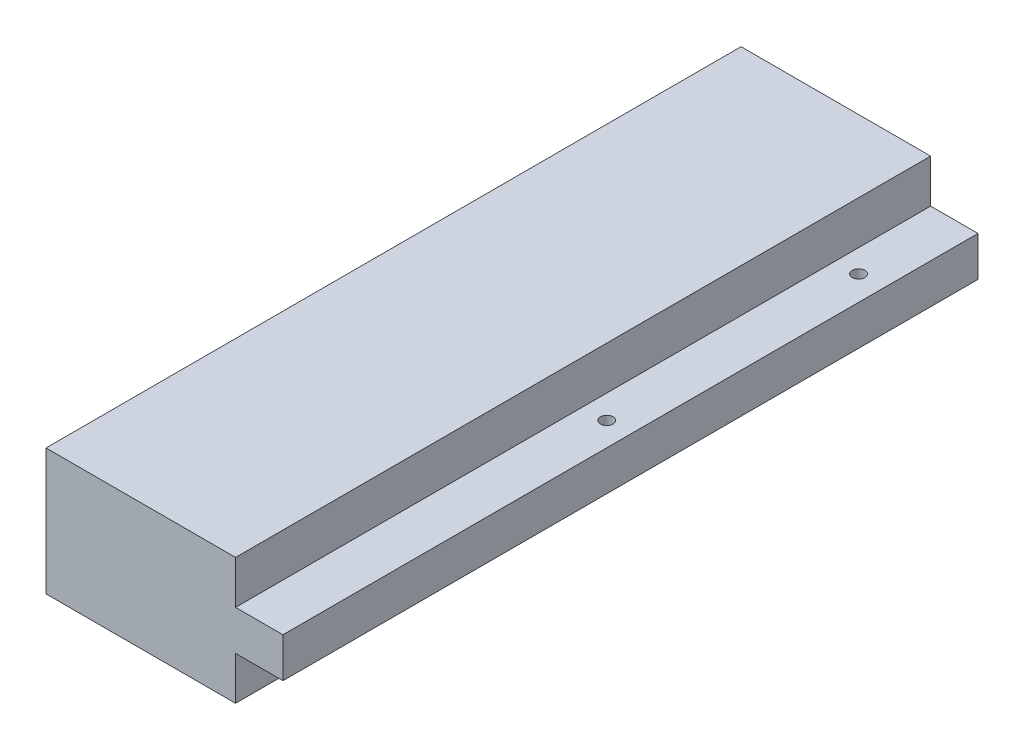
ISO-10303-21;
HEADER;
FILE_DESCRIPTION(('STEP AP214'),'2;1');
FILE_NAME('part.step','',(''),(''),'','','');
FILE_SCHEMA(('AUTOMOTIVE_DESIGN { 1 0 10303 214 1 1 1 1 }'));
ENDSEC;
DATA;
#1=APPLICATION_CONTEXT('core data for automotive mechanical design processes');
#2=APPLICATION_PROTOCOL_DEFINITION('international standard','automotive_design',2000,#1);
#3=PRODUCT_CONTEXT('',#1,'mechanical');
#4=PRODUCT('Part','Part','',(#3));
#5=PRODUCT_RELATED_PRODUCT_CATEGORY('part','',(#4));
#6=PRODUCT_DEFINITION_FORMATION('','',#4);
#7=PRODUCT_DEFINITION_CONTEXT('part definition',#1,'design');
#8=PRODUCT_DEFINITION('design','',#6,#7);
#9=PRODUCT_DEFINITION_SHAPE('','',#8);
#10=(LENGTH_UNIT() NAMED_UNIT(*) SI_UNIT(.MILLI.,.METRE.));
#11=(NAMED_UNIT(*) PLANE_ANGLE_UNIT() SI_UNIT($,.RADIAN.));
#12=(NAMED_UNIT(*) SI_UNIT($,.STERADIAN.) SOLID_ANGLE_UNIT());
#13=UNCERTAINTY_MEASURE_WITH_UNIT(LENGTH_MEASURE(1.E-05),#10,'distance_accuracy_value','');
#14=(GEOMETRIC_REPRESENTATION_CONTEXT(3) GLOBAL_UNCERTAINTY_ASSIGNED_CONTEXT((#13)) GLOBAL_UNIT_ASSIGNED_CONTEXT((#10,
#11,#12)) REPRESENTATION_CONTEXT('',''));
#15=CARTESIAN_POINT('',(0.,0.,0.));
#16=DIRECTION('',(0.,0.,1.));
#17=DIRECTION('',(1.,0.,0.));
#18=AXIS2_PLACEMENT_3D('',#15,#16,#17);
#19=CARTESIAN_POINT('',(0.,200.,1100.));
#20=DIRECTION('',(1.,0.,0.));
#21=DIRECTION('',(0.,1.,0.));
#22=AXIS2_PLACEMENT_3D('',#19,#20,#21);
#23=PLANE('',#22);
#24=DIRECTION('',(0.,-1.,0.));
#25=VECTOR('',#24,1.);
#26=CARTESIAN_POINT('',(0.,200.,0.));
#27=LINE('',#26,#25);
#28=CARTESIAN_POINT('',(0.,200.,0.));
#29=VERTEX_POINT('',#28);
#30=CARTESIAN_POINT('',(0.,0.,0.));
#31=VERTEX_POINT('',#30);
#32=EDGE_CURVE('E129',#29,#31,#27,.T.);
#33=ORIENTED_EDGE('',*,*,#32,.T.);
#34=DIRECTION('',(0.,0.,-1.));
#35=VECTOR('',#34,1.);
#36=CARTESIAN_POINT('',(0.,0.,1100.));
#37=LINE('',#36,#35);
#38=CARTESIAN_POINT('',(0.,0.,1100.));
#39=VERTEX_POINT('',#38);
#40=EDGE_CURVE('E11',#39,#31,#37,.T.);
#41=ORIENTED_EDGE('',*,*,#40,.F.);
#42=DIRECTION('',(0.,-1.,0.));
#43=VECTOR('',#42,1.);
#44=CARTESIAN_POINT('',(0.,200.,1100.));
#45=LINE('',#44,#43);
#46=CARTESIAN_POINT('',(0.,200.,1100.));
#47=VERTEX_POINT('',#46);
#48=EDGE_CURVE('E144',#47,#39,#45,.T.);
#49=ORIENTED_EDGE('',*,*,#48,.F.);
#50=DIRECTION('',(0.,0.,-1.));
#51=VECTOR('',#50,1.);
#52=CARTESIAN_POINT('',(0.,200.,1100.));
#53=LINE('',#52,#51);
#54=EDGE_CURVE('E125',#47,#29,#53,.T.);
#55=ORIENTED_EDGE('',*,*,#54,.T.);
#56=EDGE_LOOP('',(#33,#41,#49,#55));
#57=FACE_BOUND('',#56,.T.);
#58=ADVANCED_FACE('F33',(#57),#23,.F.);
#59=CARTESIAN_POINT('',(0.,0.,1100.));
#60=DIRECTION('',(0.,1.,0.));
#61=DIRECTION('',(0.,0.,1.));
#62=AXIS2_PLACEMENT_3D('',#59,#60,#61);
#63=PLANE('',#62);
#64=DIRECTION('',(1.,0.,0.));
#65=VECTOR('',#64,1.);
#66=CARTESIAN_POINT('',(0.,0.,0.));
#67=LINE('',#66,#65);
#68=CARTESIAN_POINT('',(300.,0.,0.));
#69=VERTEX_POINT('',#68);
#70=EDGE_CURVE('E132',#31,#69,#67,.T.);
#71=ORIENTED_EDGE('',*,*,#70,.T.);
#72=DIRECTION('',(0.,0.,-1.));
#73=VECTOR('',#72,1.);
#74=CARTESIAN_POINT('',(300.,0.,1100.));
#75=LINE('',#74,#73);
#76=CARTESIAN_POINT('',(300.,0.,1100.));
#77=VERTEX_POINT('',#76);
#78=EDGE_CURVE('E41',#77,#69,#75,.T.);
#79=ORIENTED_EDGE('',*,*,#78,.F.);
#80=DIRECTION('',(1.,0.,0.));
#81=VECTOR('',#80,1.);
#82=CARTESIAN_POINT('',(0.,0.,1100.));
#83=LINE('',#82,#81);
#84=EDGE_CURVE('E92',#39,#77,#83,.T.);
#85=ORIENTED_EDGE('',*,*,#84,.F.);
#86=ORIENTED_EDGE('',*,*,#40,.T.);
#87=EDGE_LOOP('',(#71,#79,#85,#86));
#88=FACE_BOUND('',#87,.T.);
#89=ADVANCED_FACE('F215',(#88),#63,.F.);
#90=CARTESIAN_POINT('',(300.,0.,1100.));
#91=DIRECTION('',(-1.,0.,0.));
#92=DIRECTION('',(0.,0.,1.));
#93=AXIS2_PLACEMENT_3D('',#90,#91,#92);
#94=PLANE('',#93);
#95=DIRECTION('',(0.,1.,0.));
#96=VECTOR('',#95,1.);
#97=CARTESIAN_POINT('',(300.,0.,0.));
#98=LINE('',#97,#96);
#99=CARTESIAN_POINT('',(300.,68.5,0.));
#100=VERTEX_POINT('',#99);
#101=EDGE_CURVE('E135',#69,#100,#98,.T.);
#102=ORIENTED_EDGE('',*,*,#101,.T.);
#103=DIRECTION('',(0.,0.,-1.));
#104=VECTOR('',#103,1.);
#105=CARTESIAN_POINT('',(300.,68.5,1100.));
#106=LINE('',#105,#104);
#107=CARTESIAN_POINT('',(300.,68.5,1100.));
#108=VERTEX_POINT('',#107);
#109=EDGE_CURVE('E151',#108,#100,#106,.T.);
#110=ORIENTED_EDGE('',*,*,#109,.F.);
#111=DIRECTION('',(0.,1.,0.));
#112=VECTOR('',#111,1.);
#113=CARTESIAN_POINT('',(300.,0.,1100.));
#114=LINE('',#113,#112);
#115=EDGE_CURVE('E159',#77,#108,#114,.T.);
#116=ORIENTED_EDGE('',*,*,#115,.F.);
#117=ORIENTED_EDGE('',*,*,#78,.T.);
#118=EDGE_LOOP('',(#102,#110,#116,#117));
#119=FACE_BOUND('',#118,.T.);
#120=ADVANCED_FACE('F157',(#119),#94,.F.);
#121=CARTESIAN_POINT('',(300.,68.5,1100.));
#122=DIRECTION('',(0.,1.,0.));
#123=DIRECTION('',(0.,0.,1.));
#124=AXIS2_PLACEMENT_3D('',#121,#122,#123);
#125=PLANE('',#124);
#126=CARTESIAN_POINT('',(336.011391587581,68.5,150.));
#127=DIRECTION('',(0.,-1.,0.));
#128=DIRECTION('',(0.,0.,-1.));
#129=AXIS2_PLACEMENT_3D('',#126,#127,#128);
#130=CIRCLE('',#129,10.);
#131=CARTESIAN_POINT('',(336.011391587581,68.5,140.));
#132=VERTEX_POINT('',#131);
#133=EDGE_CURVE('E185',#132,#132,#130,.T.);
#134=ORIENTED_EDGE('',*,*,#133,.F.);
#135=EDGE_LOOP('',(#134));
#136=FACE_BOUND('',#135,.T.);
#137=CARTESIAN_POINT('',(337.5,68.5,550.));
#138=DIRECTION('',(0.,-1.,0.));
#139=DIRECTION('',(0.,0.,-1.));
#140=AXIS2_PLACEMENT_3D('',#137,#138,#139);
#141=CIRCLE('',#140,9.99999999999998);
#142=CARTESIAN_POINT('',(337.5,68.5,540.));
#143=VERTEX_POINT('',#142);
#144=EDGE_CURVE('E179',#143,#143,#141,.T.);
#145=ORIENTED_EDGE('',*,*,#144,.F.);
#146=EDGE_LOOP('',(#145));
#147=FACE_BOUND('',#146,.T.);
#148=DIRECTION('',(1.,0.,0.));
#149=VECTOR('',#148,1.);
#150=CARTESIAN_POINT('',(300.,68.5,0.));
#151=LINE('',#150,#149);
#152=CARTESIAN_POINT('',(375.,68.5,0.));
#153=VERTEX_POINT('',#152);
#154=EDGE_CURVE('E137',#100,#153,#151,.T.);
#155=ORIENTED_EDGE('',*,*,#154,.T.);
#156=DIRECTION('',(0.,0.,-1.));
#157=VECTOR('',#156,1.);
#158=CARTESIAN_POINT('',(375.,68.5,1100.));
#159=LINE('',#158,#157);
#160=CARTESIAN_POINT('',(375.,68.5,1100.));
#161=VERTEX_POINT('',#160);
#162=EDGE_CURVE('E148',#161,#153,#159,.T.);
#163=ORIENTED_EDGE('',*,*,#162,.F.);
#164=DIRECTION('',(1.,0.,0.));
#165=VECTOR('',#164,1.);
#166=CARTESIAN_POINT('',(300.,68.5,1100.));
#167=LINE('',#166,#165);
#168=EDGE_CURVE('E171',#108,#161,#167,.T.);
#169=ORIENTED_EDGE('',*,*,#168,.F.);
#170=ORIENTED_EDGE('',*,*,#109,.T.);
#171=EDGE_LOOP('',(#155,#163,#169,#170));
#172=FACE_BOUND('',#171,.T.);
#173=ADVANCED_FACE('F167',(#136,#147,#172),#125,.F.);
#174=CARTESIAN_POINT('',(375.,68.5,1100.));
#175=DIRECTION('',(-1.,0.,0.));
#176=DIRECTION('',(0.,0.,1.));
#177=AXIS2_PLACEMENT_3D('',#174,#175,#176);
#178=PLANE('',#177);
#179=DIRECTION('',(0.,1.,0.));
#180=VECTOR('',#179,1.);
#181=CARTESIAN_POINT('',(375.,68.5,0.));
#182=LINE('',#181,#180);
#183=CARTESIAN_POINT('',(375.,131.5,0.));
#184=VERTEX_POINT('',#183);
#185=EDGE_CURVE('E139',#153,#184,#182,.T.);
#186=ORIENTED_EDGE('',*,*,#185,.T.);
#187=DIRECTION('',(0.,0.,-1.));
#188=VECTOR('',#187,1.);
#189=CARTESIAN_POINT('',(375.,131.5,1100.));
#190=LINE('',#189,#188);
#191=CARTESIAN_POINT('',(375.,131.5,1100.));
#192=VERTEX_POINT('',#191);
#193=EDGE_CURVE('E120',#192,#184,#190,.T.);
#194=ORIENTED_EDGE('',*,*,#193,.F.);
#195=DIRECTION('',(0.,1.,0.));
#196=VECTOR('',#195,1.);
#197=CARTESIAN_POINT('',(375.,68.5,1100.));
#198=LINE('',#197,#196);
#199=EDGE_CURVE('E111',#161,#192,#198,.T.);
#200=ORIENTED_EDGE('',*,*,#199,.F.);
#201=ORIENTED_EDGE('',*,*,#162,.T.);
#202=EDGE_LOOP('',(#186,#194,#200,#201));
#203=FACE_BOUND('',#202,.T.);
#204=ADVANCED_FACE('F170',(#203),#178,.F.);
#205=CARTESIAN_POINT('',(375.,131.5,1100.));
#206=DIRECTION('',(0.,-1.,0.));
#207=DIRECTION('',(1.,0.,0.));
#208=AXIS2_PLACEMENT_3D('',#205,#206,#207);
#209=PLANE('',#208);
#210=CARTESIAN_POINT('',(336.011391587581,131.5,150.));
#211=DIRECTION('',(0.,-1.,0.));
#212=DIRECTION('',(1.,0.,0.));
#213=AXIS2_PLACEMENT_3D('',#210,#211,#212);
#214=CIRCLE('',#213,10.);
#215=CARTESIAN_POINT('',(346.011391587581,131.5,150.));
#216=VERTEX_POINT('',#215);
#217=EDGE_CURVE('E182',#216,#216,#214,.F.);
#218=ORIENTED_EDGE('',*,*,#217,.F.);
#219=EDGE_LOOP('',(#218));
#220=FACE_BOUND('',#219,.T.);
#221=CARTESIAN_POINT('',(337.5,131.5,550.));
#222=DIRECTION('',(0.,-1.,0.));
#223=DIRECTION('',(1.,0.,0.));
#224=AXIS2_PLACEMENT_3D('',#221,#222,#223);
#225=CIRCLE('',#224,9.99999999999998);
#226=CARTESIAN_POINT('',(347.5,131.5,550.));
#227=VERTEX_POINT('',#226);
#228=EDGE_CURVE('E133',#227,#227,#225,.F.);
#229=ORIENTED_EDGE('',*,*,#228,.F.);
#230=EDGE_LOOP('',(#229));
#231=FACE_BOUND('',#230,.T.);
#232=DIRECTION('',(-1.,0.,0.));
#233=VECTOR('',#232,1.);
#234=CARTESIAN_POINT('',(375.,131.5,0.));
#235=LINE('',#234,#233);
#236=CARTESIAN_POINT('',(300.,131.5,0.));
#237=VERTEX_POINT('',#236);
#238=EDGE_CURVE('E119',#184,#237,#235,.T.);
#239=ORIENTED_EDGE('',*,*,#238,.T.);
#240=DIRECTION('',(0.,0.,-1.));
#241=VECTOR('',#240,1.);
#242=CARTESIAN_POINT('',(300.,131.5,1100.));
#243=LINE('',#242,#241);
#244=CARTESIAN_POINT('',(300.,131.5,1100.));
#245=VERTEX_POINT('',#244);
#246=EDGE_CURVE('E116',#245,#237,#243,.T.);
#247=ORIENTED_EDGE('',*,*,#246,.F.);
#248=DIRECTION('',(-1.,0.,0.));
#249=VECTOR('',#248,1.);
#250=CARTESIAN_POINT('',(375.,131.5,1100.));
#251=LINE('',#250,#249);
#252=EDGE_CURVE('E105',#192,#245,#251,.T.);
#253=ORIENTED_EDGE('',*,*,#252,.F.);
#254=ORIENTED_EDGE('',*,*,#193,.T.);
#255=EDGE_LOOP('',(#239,#247,#253,#254));
#256=FACE_BOUND('',#255,.T.);
#257=ADVANCED_FACE('F117',(#220,#231,#256),#209,.F.);
#258=CARTESIAN_POINT('',(300.,131.5,1100.));
#259=DIRECTION('',(-1.,0.,0.));
#260=DIRECTION('',(0.,0.,1.));
#261=AXIS2_PLACEMENT_3D('',#258,#259,#260);
#262=PLANE('',#261);
#263=DIRECTION('',(0.,1.,0.));
#264=VECTOR('',#263,1.);
#265=CARTESIAN_POINT('',(300.,131.5,0.));
#266=LINE('',#265,#264);
#267=CARTESIAN_POINT('',(300.,200.,0.));
#268=VERTEX_POINT('',#267);
#269=EDGE_CURVE('E78',#237,#268,#266,.T.);
#270=ORIENTED_EDGE('',*,*,#269,.T.);
#271=DIRECTION('',(0.,0.,-1.));
#272=VECTOR('',#271,1.);
#273=CARTESIAN_POINT('',(300.,200.,1100.));
#274=LINE('',#273,#272);
#275=CARTESIAN_POINT('',(300.,200.,1100.));
#276=VERTEX_POINT('',#275);
#277=EDGE_CURVE('E121',#276,#268,#274,.T.);
#278=ORIENTED_EDGE('',*,*,#277,.F.);
#279=DIRECTION('',(0.,1.,0.));
#280=VECTOR('',#279,1.);
#281=CARTESIAN_POINT('',(300.,131.5,1100.));
#282=LINE('',#281,#280);
#283=EDGE_CURVE('E109',#245,#276,#282,.T.);
#284=ORIENTED_EDGE('',*,*,#283,.F.);
#285=ORIENTED_EDGE('',*,*,#246,.T.);
#286=EDGE_LOOP('',(#270,#278,#284,#285));
#287=FACE_BOUND('',#286,.T.);
#288=ADVANCED_FACE('F123',(#287),#262,.F.);
#289=CARTESIAN_POINT('',(300.,200.,1100.));
#290=DIRECTION('',(0.,-1.,0.));
#291=DIRECTION('',(1.,0.,0.));
#292=AXIS2_PLACEMENT_3D('',#289,#290,#291);
#293=PLANE('',#292);
#294=DIRECTION('',(-1.,0.,0.));
#295=VECTOR('',#294,1.);
#296=CARTESIAN_POINT('',(300.,200.,0.));
#297=LINE('',#296,#295);
#298=EDGE_CURVE('E84',#268,#29,#297,.T.);
#299=ORIENTED_EDGE('',*,*,#298,.T.);
#300=ORIENTED_EDGE('',*,*,#54,.F.);
#301=DIRECTION('',(-1.,0.,0.));
#302=VECTOR('',#301,1.);
#303=CARTESIAN_POINT('',(300.,200.,1100.));
#304=LINE('',#303,#302);
#305=EDGE_CURVE('E49',#276,#47,#304,.T.);
#306=ORIENTED_EDGE('',*,*,#305,.F.);
#307=ORIENTED_EDGE('',*,*,#277,.T.);
#308=EDGE_LOOP('',(#299,#300,#306,#307));
#309=FACE_BOUND('',#308,.T.);
#310=ADVANCED_FACE('F210',(#309),#293,.F.);
#311=CARTESIAN_POINT('',(0.,0.,1100.));
#312=DIRECTION('',(0.,0.,1.));
#313=DIRECTION('',(1.,0.,0.));
#314=AXIS2_PLACEMENT_3D('',#311,#312,#313);
#315=PLANE('',#314);
#316=ORIENTED_EDGE('',*,*,#48,.T.);
#317=ORIENTED_EDGE('',*,*,#84,.T.);
#318=ORIENTED_EDGE('',*,*,#115,.T.);
#319=ORIENTED_EDGE('',*,*,#168,.T.);
#320=ORIENTED_EDGE('',*,*,#199,.T.);
#321=ORIENTED_EDGE('',*,*,#252,.T.);
#322=ORIENTED_EDGE('',*,*,#283,.T.);
#323=ORIENTED_EDGE('',*,*,#305,.T.);
#324=EDGE_LOOP('',(#316,#317,#318,#319,#320,#321,#322,#323));
#325=FACE_BOUND('',#324,.T.);
#326=ADVANCED_FACE('F107',(#325),#315,.T.);
#327=CARTESIAN_POINT('',(0.,0.,0.));
#328=DIRECTION('',(0.,0.,1.));
#329=DIRECTION('',(1.,0.,0.));
#330=AXIS2_PLACEMENT_3D('',#327,#328,#329);
#331=PLANE('',#330);
#332=ORIENTED_EDGE('',*,*,#32,.F.);
#333=ORIENTED_EDGE('',*,*,#298,.F.);
#334=ORIENTED_EDGE('',*,*,#269,.F.);
#335=ORIENTED_EDGE('',*,*,#238,.F.);
#336=ORIENTED_EDGE('',*,*,#185,.F.);
#337=ORIENTED_EDGE('',*,*,#154,.F.);
#338=ORIENTED_EDGE('',*,*,#101,.F.);
#339=ORIENTED_EDGE('',*,*,#70,.F.);
#340=EDGE_LOOP('',(#332,#333,#334,#335,#336,#337,#338,#339));
#341=FACE_BOUND('',#340,.T.);
#342=ADVANCED_FACE('F163',(#341),#331,.F.);
#343=CARTESIAN_POINT('',(337.5,200.001,550.));
#344=DIRECTION('',(0.,-1.,0.));
#345=DIRECTION('',(0.,0.,-1.));
#346=AXIS2_PLACEMENT_3D('',#343,#344,#345);
#347=CYLINDRICAL_SURFACE('',#346,9.99999999999998);
#348=ORIENTED_EDGE('',*,*,#144,.T.);
#349=EDGE_LOOP('',(#348));
#350=FACE_BOUND('',#349,.T.);
#351=ORIENTED_EDGE('',*,*,#228,.T.);
#352=EDGE_LOOP('',(#351));
#353=FACE_BOUND('',#352,.T.);
#354=ADVANCED_FACE('F197',(#350,#353),#347,.F.);
#355=CARTESIAN_POINT('',(336.011391587581,200.001,150.));
#356=DIRECTION('',(0.,-1.,0.));
#357=DIRECTION('',(0.,0.,-1.));
#358=AXIS2_PLACEMENT_3D('',#355,#356,#357);
#359=CYLINDRICAL_SURFACE('',#358,10.);
#360=ORIENTED_EDGE('',*,*,#133,.T.);
#361=EDGE_LOOP('',(#360));
#362=FACE_BOUND('',#361,.T.);
#363=ORIENTED_EDGE('',*,*,#217,.T.);
#364=EDGE_LOOP('',(#363));
#365=FACE_BOUND('',#364,.T.);
#366=ADVANCED_FACE('F189',(#362,#365),#359,.F.);
#367=CLOSED_SHELL('',(#58,#89,#120,#173,#204,#257,#288,#310,#326,#342,#354,#366));
#368=MANIFOLD_SOLID_BREP('B2',#367);
#369=ADVANCED_BREP_SHAPE_REPRESENTATION('',(#18,#368),#14);
#370=SHAPE_DEFINITION_REPRESENTATION(#9,#369);
ENDSEC;
END-ISO-10303-21;
